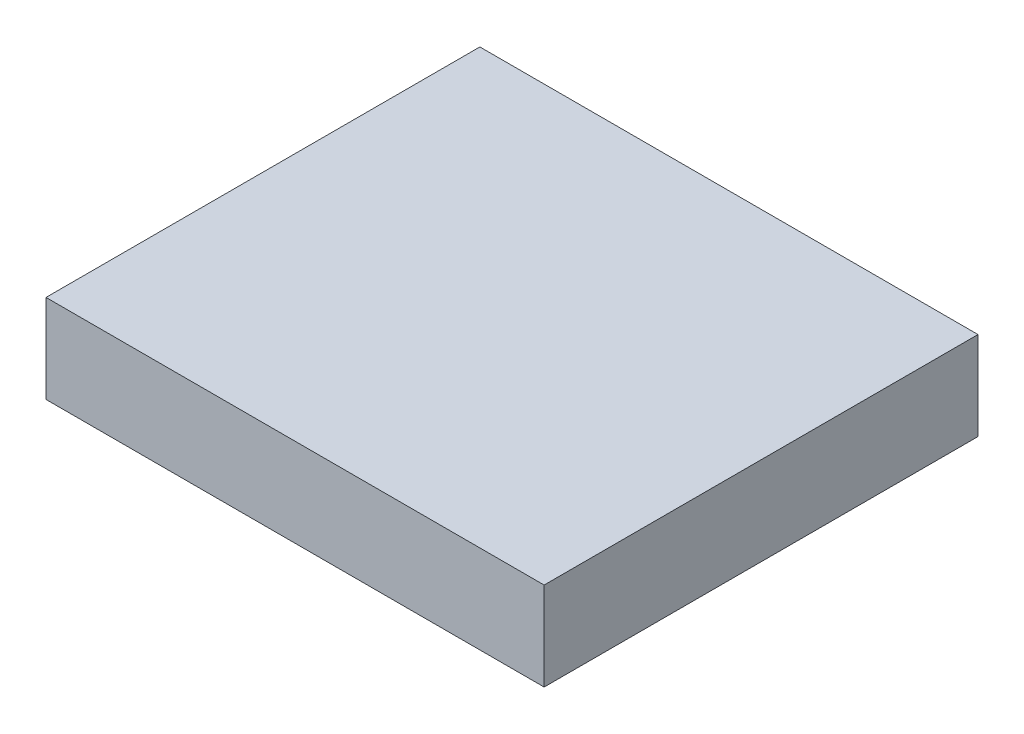
ISO-10303-21;
HEADER;
FILE_DESCRIPTION(('STEP AP214'),'2;1');
FILE_NAME('part.step','',(''),(''),'','','');
FILE_SCHEMA(('AUTOMOTIVE_DESIGN { 1 0 10303 214 1 1 1 1 }'));
ENDSEC;
DATA;
#1=APPLICATION_CONTEXT('core data for automotive mechanical design processes');
#2=APPLICATION_PROTOCOL_DEFINITION('international standard','automotive_design',2000,#1);
#3=PRODUCT_CONTEXT('',#1,'mechanical');
#4=PRODUCT('Part','Part','',(#3));
#5=PRODUCT_RELATED_PRODUCT_CATEGORY('part','',(#4));
#6=PRODUCT_DEFINITION_FORMATION('','',#4);
#7=PRODUCT_DEFINITION_CONTEXT('part definition',#1,'design');
#8=PRODUCT_DEFINITION('design','',#6,#7);
#9=PRODUCT_DEFINITION_SHAPE('','',#8);
#10=(LENGTH_UNIT() NAMED_UNIT(*) SI_UNIT(.MILLI.,.METRE.));
#11=(NAMED_UNIT(*) PLANE_ANGLE_UNIT() SI_UNIT($,.RADIAN.));
#12=(NAMED_UNIT(*) SI_UNIT($,.STERADIAN.) SOLID_ANGLE_UNIT());
#13=UNCERTAINTY_MEASURE_WITH_UNIT(LENGTH_MEASURE(1.E-05),#10,'distance_accuracy_value','');
#14=(GEOMETRIC_REPRESENTATION_CONTEXT(3) GLOBAL_UNCERTAINTY_ASSIGNED_CONTEXT((#13)) GLOBAL_UNIT_ASSIGNED_CONTEXT((#10,
#11,#12)) REPRESENTATION_CONTEXT('',''));
#15=CARTESIAN_POINT('',(0.,0.,0.));
#16=DIRECTION('',(0.,0.,1.));
#17=DIRECTION('',(1.,0.,0.));
#18=AXIS2_PLACEMENT_3D('',#15,#16,#17);
#19=CARTESIAN_POINT('',(40.,1690.,-580.));
#20=DIRECTION('',(-1.,0.,0.));
#21=DIRECTION('',(0.,0.,1.));
#22=AXIS2_PLACEMENT_3D('',#19,#20,#21);
#23=PLANE('',#22);
#24=DIRECTION('',(0.,-1.,0.));
#25=VECTOR('',#24,1.);
#26=CARTESIAN_POINT('',(40.,1690.,-40.));
#27=LINE('',#26,#25);
#28=CARTESIAN_POINT('',(40.,1800.,-40.));
#29=VERTEX_POINT('',#28);
#30=CARTESIAN_POINT('',(40.,1690.,-40.));
#31=VERTEX_POINT('',#30);
#32=EDGE_CURVE('E103',#29,#31,#27,.T.);
#33=ORIENTED_EDGE('',*,*,#32,.F.);
#34=DIRECTION('',(0.,0.,1.));
#35=VECTOR('',#34,1.);
#36=CARTESIAN_POINT('',(40.,1800.,-580.));
#37=LINE('',#36,#35);
#38=CARTESIAN_POINT('',(40.,1800.,-580.));
#39=VERTEX_POINT('',#38);
#40=EDGE_CURVE('E11',#39,#29,#37,.T.);
#41=ORIENTED_EDGE('',*,*,#40,.F.);
#42=DIRECTION('',(0.,-1.,0.));
#43=VECTOR('',#42,1.);
#44=CARTESIAN_POINT('',(40.,1690.,-580.));
#45=LINE('',#44,#43);
#46=CARTESIAN_POINT('',(40.,1690.,-580.));
#47=VERTEX_POINT('',#46);
#48=EDGE_CURVE('E97',#39,#47,#45,.T.);
#49=ORIENTED_EDGE('',*,*,#48,.T.);
#50=DIRECTION('',(0.,0.,1.));
#51=VECTOR('',#50,1.);
#52=CARTESIAN_POINT('',(40.,1690.,-580.));
#53=LINE('',#52,#51);
#54=EDGE_CURVE('E42',#47,#31,#53,.T.);
#55=ORIENTED_EDGE('',*,*,#54,.T.);
#56=EDGE_LOOP('',(#33,#41,#49,#55));
#57=FACE_BOUND('',#56,.T.);
#58=ADVANCED_FACE('F39',(#57),#23,.T.);
#59=CARTESIAN_POINT('',(40.,1800.,-580.));
#60=DIRECTION('',(0.,1.,0.));
#61=DIRECTION('',(0.,0.,1.));
#62=AXIS2_PLACEMENT_3D('',#59,#60,#61);
#63=PLANE('',#62);
#64=DIRECTION('',(-1.,0.,0.));
#65=VECTOR('',#64,1.);
#66=CARTESIAN_POINT('',(40.,1800.,-40.));
#67=LINE('',#66,#65);
#68=CARTESIAN_POINT('',(660.,1800.,-40.));
#69=VERTEX_POINT('',#68);
#70=EDGE_CURVE('E99',#69,#29,#67,.T.);
#71=ORIENTED_EDGE('',*,*,#70,.F.);
#72=DIRECTION('',(0.,0.,1.));
#73=VECTOR('',#72,1.);
#74=CARTESIAN_POINT('',(660.,1800.,-580.));
#75=LINE('',#74,#73);
#76=CARTESIAN_POINT('',(660.,1800.,-580.));
#77=VERTEX_POINT('',#76);
#78=EDGE_CURVE('E48',#77,#69,#75,.T.);
#79=ORIENTED_EDGE('',*,*,#78,.F.);
#80=DIRECTION('',(-1.,0.,0.));
#81=VECTOR('',#80,1.);
#82=CARTESIAN_POINT('',(40.,1800.,-580.));
#83=LINE('',#82,#81);
#84=EDGE_CURVE('E94',#77,#39,#83,.T.);
#85=ORIENTED_EDGE('',*,*,#84,.T.);
#86=ORIENTED_EDGE('',*,*,#40,.T.);
#87=EDGE_LOOP('',(#71,#79,#85,#86));
#88=FACE_BOUND('',#87,.T.);
#89=ADVANCED_FACE('F113',(#88),#63,.T.);
#90=CARTESIAN_POINT('',(660.,1690.,-580.));
#91=DIRECTION('',(1.,0.,0.));
#92=DIRECTION('',(0.,0.,-1.));
#93=AXIS2_PLACEMENT_3D('',#90,#91,#92);
#94=PLANE('',#93);
#95=DIRECTION('',(0.,1.,0.));
#96=VECTOR('',#95,1.);
#97=CARTESIAN_POINT('',(660.,1690.,-40.));
#98=LINE('',#97,#96);
#99=CARTESIAN_POINT('',(660.,1690.,-40.));
#100=VERTEX_POINT('',#99);
#101=EDGE_CURVE('E89',#100,#69,#98,.T.);
#102=ORIENTED_EDGE('',*,*,#101,.F.);
#103=DIRECTION('',(0.,0.,1.));
#104=VECTOR('',#103,1.);
#105=CARTESIAN_POINT('',(660.,1690.,-580.));
#106=LINE('',#105,#104);
#107=CARTESIAN_POINT('',(660.,1690.,-580.));
#108=VERTEX_POINT('',#107);
#109=EDGE_CURVE('E84',#108,#100,#106,.T.);
#110=ORIENTED_EDGE('',*,*,#109,.F.);
#111=DIRECTION('',(0.,1.,0.));
#112=VECTOR('',#111,1.);
#113=CARTESIAN_POINT('',(660.,1690.,-580.));
#114=LINE('',#113,#112);
#115=EDGE_CURVE('E87',#108,#77,#114,.T.);
#116=ORIENTED_EDGE('',*,*,#115,.T.);
#117=ORIENTED_EDGE('',*,*,#78,.T.);
#118=EDGE_LOOP('',(#102,#110,#116,#117));
#119=FACE_BOUND('',#118,.T.);
#120=ADVANCED_FACE('F86',(#119),#94,.T.);
#121=CARTESIAN_POINT('',(40.,1690.,-580.));
#122=DIRECTION('',(0.,-1.,0.));
#123=DIRECTION('',(0.,0.,-1.));
#124=AXIS2_PLACEMENT_3D('',#121,#122,#123);
#125=PLANE('',#124);
#126=DIRECTION('',(1.,0.,0.));
#127=VECTOR('',#126,1.);
#128=CARTESIAN_POINT('',(40.,1690.,-40.));
#129=LINE('',#128,#127);
#130=EDGE_CURVE('E106',#31,#100,#129,.T.);
#131=ORIENTED_EDGE('',*,*,#130,.F.);
#132=ORIENTED_EDGE('',*,*,#54,.F.);
#133=DIRECTION('',(1.,0.,0.));
#134=VECTOR('',#133,1.);
#135=CARTESIAN_POINT('',(40.,1690.,-580.));
#136=LINE('',#135,#134);
#137=EDGE_CURVE('E93',#47,#108,#136,.T.);
#138=ORIENTED_EDGE('',*,*,#137,.T.);
#139=ORIENTED_EDGE('',*,*,#109,.T.);
#140=EDGE_LOOP('',(#131,#132,#138,#139));
#141=FACE_BOUND('',#140,.T.);
#142=ADVANCED_FACE('F96',(#141),#125,.T.);
#143=CARTESIAN_POINT('',(0.,0.,-580.));
#144=DIRECTION('',(0.,0.,-1.));
#145=DIRECTION('',(-1.,0.,0.));
#146=AXIS2_PLACEMENT_3D('',#143,#144,#145);
#147=PLANE('',#146);
#148=ORIENTED_EDGE('',*,*,#48,.F.);
#149=ORIENTED_EDGE('',*,*,#84,.F.);
#150=ORIENTED_EDGE('',*,*,#115,.F.);
#151=ORIENTED_EDGE('',*,*,#137,.F.);
#152=EDGE_LOOP('',(#148,#149,#150,#151));
#153=FACE_BOUND('',#152,.T.);
#154=ADVANCED_FACE('F92',(#153),#147,.T.);
#155=CARTESIAN_POINT('',(0.,0.,-40.));
#156=DIRECTION('',(0.,0.,-1.));
#157=DIRECTION('',(-1.,0.,0.));
#158=AXIS2_PLACEMENT_3D('',#155,#156,#157);
#159=PLANE('',#158);
#160=ORIENTED_EDGE('',*,*,#32,.T.);
#161=ORIENTED_EDGE('',*,*,#130,.T.);
#162=ORIENTED_EDGE('',*,*,#101,.T.);
#163=ORIENTED_EDGE('',*,*,#70,.T.);
#164=EDGE_LOOP('',(#160,#161,#162,#163));
#165=FACE_BOUND('',#164,.T.);
#166=ADVANCED_FACE('F112',(#165),#159,.F.);
#167=CLOSED_SHELL('',(#58,#89,#120,#142,#154,#166));
#168=MANIFOLD_SOLID_BREP('B2',#167);
#169=ADVANCED_BREP_SHAPE_REPRESENTATION('',(#18,#168),#14);
#170=SHAPE_DEFINITION_REPRESENTATION(#9,#169);
ENDSEC;
END-ISO-10303-21;
